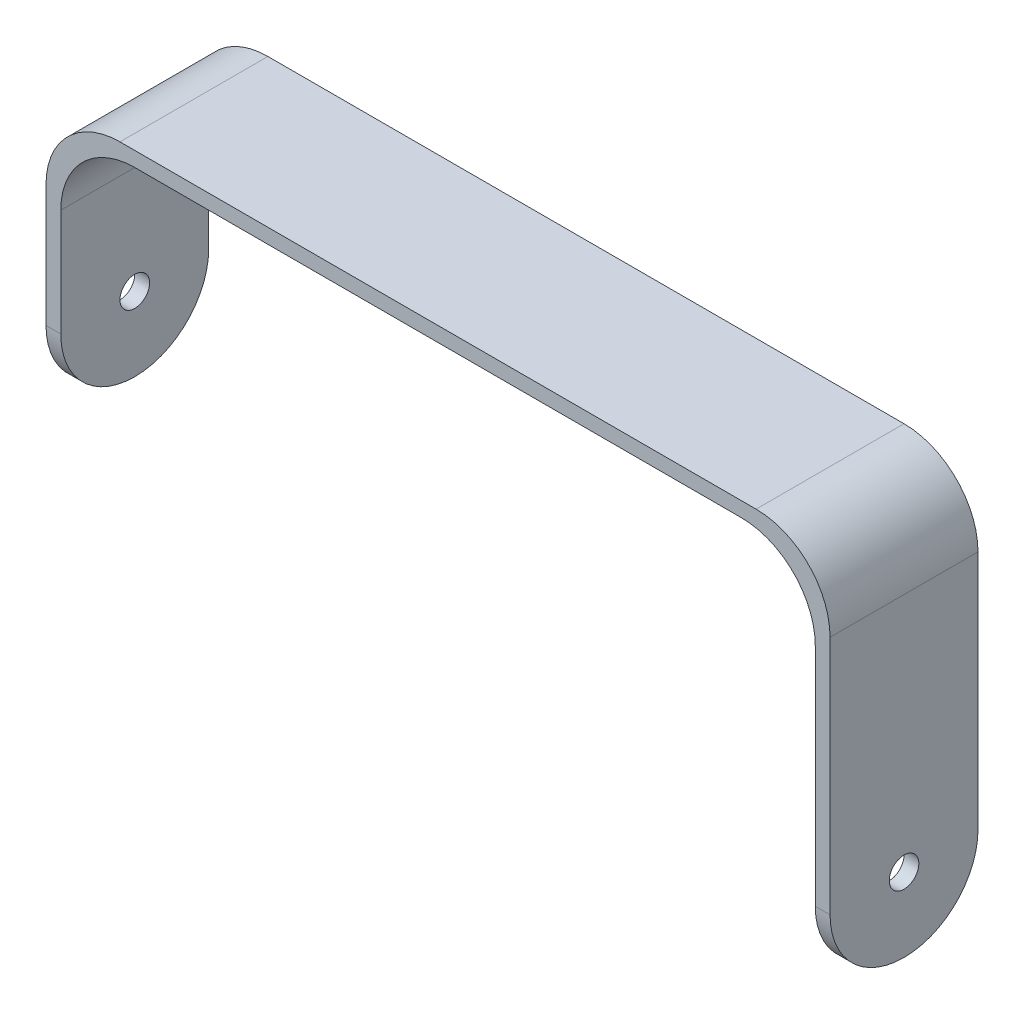
ISO-10303-21;
HEADER;
FILE_DESCRIPTION(('STEP AP214'),'2;1');
FILE_NAME('part.step','',(''),(''),'','','');
FILE_SCHEMA(('AUTOMOTIVE_DESIGN { 1 0 10303 214 1 1 1 1 }'));
ENDSEC;
DATA;
#1=APPLICATION_CONTEXT('core data for automotive mechanical design processes');
#2=APPLICATION_PROTOCOL_DEFINITION('international standard','automotive_design',2000,#1);
#3=PRODUCT_CONTEXT('',#1,'mechanical');
#4=PRODUCT('Part','Part','',(#3));
#5=PRODUCT_RELATED_PRODUCT_CATEGORY('part','',(#4));
#6=PRODUCT_DEFINITION_FORMATION('','',#4);
#7=PRODUCT_DEFINITION_CONTEXT('part definition',#1,'design');
#8=PRODUCT_DEFINITION('design','',#6,#7);
#9=PRODUCT_DEFINITION_SHAPE('','',#8);
#10=(LENGTH_UNIT() NAMED_UNIT(*) SI_UNIT(.MILLI.,.METRE.));
#11=(NAMED_UNIT(*) PLANE_ANGLE_UNIT() SI_UNIT($,.RADIAN.));
#12=(NAMED_UNIT(*) SI_UNIT($,.STERADIAN.) SOLID_ANGLE_UNIT());
#13=UNCERTAINTY_MEASURE_WITH_UNIT(LENGTH_MEASURE(1.E-05),#10,'distance_accuracy_value','');
#14=(GEOMETRIC_REPRESENTATION_CONTEXT(3) GLOBAL_UNCERTAINTY_ASSIGNED_CONTEXT((#13)) GLOBAL_UNIT_ASSIGNED_CONTEXT((#10,
#11,#12)) REPRESENTATION_CONTEXT('',''));
#15=CARTESIAN_POINT('',(0.,0.,0.));
#16=DIRECTION('',(0.,0.,1.));
#17=DIRECTION('',(1.,0.,0.));
#18=AXIS2_PLACEMENT_3D('',#15,#16,#17);
#19=CARTESIAN_POINT('',(-51.,0.,-10.));
#20=DIRECTION('',(0.,0.,-1.));
#21=DIRECTION('',(0.,-1.,0.));
#22=AXIS2_PLACEMENT_3D('',#19,#20,#21);
#23=PLANE('',#22);
#24=DIRECTION('',(0.,1.,0.));
#25=VECTOR('',#24,1.);
#26=CARTESIAN_POINT('',(53.,0.,-10.));
#27=LINE('',#26,#25);
#28=CARTESIAN_POINT('',(53.,-5.49999999999997,-10.));
#29=VERTEX_POINT('',#28);
#30=CARTESIAN_POINT('',(53.,27.,-10.));
#31=VERTEX_POINT('',#30);
#32=EDGE_CURVE('E145',#29,#31,#27,.T.);
#33=ORIENTED_EDGE('',*,*,#32,.F.);
#34=DIRECTION('',(1.,0.,0.));
#35=VECTOR('',#34,1.);
#36=CARTESIAN_POINT('',(28.411286003847,-5.49999999999997,-10.));
#37=LINE('',#36,#35);
#38=CARTESIAN_POINT('',(51.,-5.49999999999997,-10.));
#39=VERTEX_POINT('',#38);
#40=EDGE_CURVE('E135',#39,#29,#37,.T.);
#41=ORIENTED_EDGE('',*,*,#40,.F.);
#42=DIRECTION('',(0.,1.,0.));
#43=VECTOR('',#42,1.);
#44=CARTESIAN_POINT('',(51.,0.,-10.));
#45=LINE('',#44,#43);
#46=CARTESIAN_POINT('',(51.,25.,-10.));
#47=VERTEX_POINT('',#46);
#48=EDGE_CURVE('E143',#39,#47,#45,.T.);
#49=ORIENTED_EDGE('',*,*,#48,.T.);
#50=CARTESIAN_POINT('',(41.,25.,-10.));
#51=DIRECTION('',(0.,0.,-1.));
#52=DIRECTION('',(-1.,0.,0.));
#53=AXIS2_PLACEMENT_3D('',#50,#51,#52);
#54=CIRCLE('',#53,10.);
#55=CARTESIAN_POINT('',(41.,35.,-10.));
#56=VERTEX_POINT('',#55);
#57=EDGE_CURVE('E191',#47,#56,#54,.F.);
#58=ORIENTED_EDGE('',*,*,#57,.T.);
#59=DIRECTION('',(-1.,0.,0.));
#60=VECTOR('',#59,1.);
#61=CARTESIAN_POINT('',(-51.,35.,-10.));
#62=LINE('',#61,#60);
#63=CARTESIAN_POINT('',(-41.,35.,-10.));
#64=VERTEX_POINT('',#63);
#65=EDGE_CURVE('E151',#56,#64,#62,.T.);
#66=ORIENTED_EDGE('',*,*,#65,.T.);
#67=CARTESIAN_POINT('',(-41.,25.,-10.));
#68=DIRECTION('',(0.,0.,-1.));
#69=DIRECTION('',(-1.,0.,0.));
#70=AXIS2_PLACEMENT_3D('',#67,#68,#69);
#71=CIRCLE('',#70,10.);
#72=CARTESIAN_POINT('',(-51.,25.,-10.));
#73=VERTEX_POINT('',#72);
#74=EDGE_CURVE('E195',#64,#73,#71,.F.);
#75=ORIENTED_EDGE('',*,*,#74,.T.);
#76=DIRECTION('',(0.,-1.,0.));
#77=VECTOR('',#76,1.);
#78=CARTESIAN_POINT('',(-51.,0.,-10.));
#79=LINE('',#78,#77);
#80=CARTESIAN_POINT('',(-51.,10.5,-10.));
#81=VERTEX_POINT('',#80);
#82=EDGE_CURVE('E155',#73,#81,#79,.T.);
#83=ORIENTED_EDGE('',*,*,#82,.T.);
#84=DIRECTION('',(-1.,0.,0.));
#85=VECTOR('',#84,1.);
#86=CARTESIAN_POINT('',(-28.411286003847,10.5,-10.));
#87=LINE('',#86,#85);
#88=CARTESIAN_POINT('',(-53.,10.5,-10.));
#89=VERTEX_POINT('',#88);
#90=EDGE_CURVE('E251',#81,#89,#87,.T.);
#91=ORIENTED_EDGE('',*,*,#90,.T.);
#92=DIRECTION('',(0.,-1.,0.));
#93=VECTOR('',#92,1.);
#94=CARTESIAN_POINT('',(-53.,0.,-10.));
#95=LINE('',#94,#93);
#96=CARTESIAN_POINT('',(-53.,27.,-10.));
#97=VERTEX_POINT('',#96);
#98=EDGE_CURVE('E206',#97,#89,#95,.T.);
#99=ORIENTED_EDGE('',*,*,#98,.F.);
#100=CARTESIAN_POINT('',(-43.,27.,-10.));
#101=DIRECTION('',(0.,0.,-1.));
#102=DIRECTION('',(-1.,0.,0.));
#103=AXIS2_PLACEMENT_3D('',#100,#101,#102);
#104=CIRCLE('',#103,10.);
#105=CARTESIAN_POINT('',(-43.,37.,-10.));
#106=VERTEX_POINT('',#105);
#107=EDGE_CURVE('E53',#97,#106,#104,.T.);
#108=ORIENTED_EDGE('',*,*,#107,.T.);
#109=DIRECTION('',(-1.,0.,0.));
#110=VECTOR('',#109,1.);
#111=CARTESIAN_POINT('',(-51.,37.,-10.));
#112=LINE('',#111,#110);
#113=CARTESIAN_POINT('',(43.,37.,-10.));
#114=VERTEX_POINT('',#113);
#115=EDGE_CURVE('E203',#114,#106,#112,.T.);
#116=ORIENTED_EDGE('',*,*,#115,.F.);
#117=CARTESIAN_POINT('',(43.,27.,-10.));
#118=DIRECTION('',(0.,0.,-1.));
#119=DIRECTION('',(-1.,0.,0.));
#120=AXIS2_PLACEMENT_3D('',#117,#118,#119);
#121=CIRCLE('',#120,10.);
#122=EDGE_CURVE('E11',#114,#31,#121,.T.);
#123=ORIENTED_EDGE('',*,*,#122,.T.);
#124=EDGE_LOOP('',(#33,#41,#49,#58,#66,#75,#83,#91,#99,#108,#116,#123));
#125=FACE_BOUND('',#124,.T.);
#126=ADVANCED_FACE('F45',(#125),#23,.T.);
#127=CARTESIAN_POINT('',(-51.,35.,10.));
#128=DIRECTION('',(0.,0.,-1.));
#129=DIRECTION('',(-1.,0.,0.));
#130=AXIS2_PLACEMENT_3D('',#127,#128,#129);
#131=PLANE('',#130);
#132=DIRECTION('',(0.,1.,0.));
#133=VECTOR('',#132,1.);
#134=CARTESIAN_POINT('',(51.,0.,10.));
#135=LINE('',#134,#133);
#136=CARTESIAN_POINT('',(51.,-5.49999999999997,10.));
#137=VERTEX_POINT('',#136);
#138=CARTESIAN_POINT('',(51.,25.,10.));
#139=VERTEX_POINT('',#138);
#140=EDGE_CURVE('E166',#137,#139,#135,.T.);
#141=ORIENTED_EDGE('',*,*,#140,.F.);
#142=DIRECTION('',(1.,0.,0.));
#143=VECTOR('',#142,1.);
#144=CARTESIAN_POINT('',(28.411286003847,-5.49999999999997,10.));
#145=LINE('',#144,#143);
#146=CARTESIAN_POINT('',(53.,-5.49999999999997,10.));
#147=VERTEX_POINT('',#146);
#148=EDGE_CURVE('E60',#137,#147,#145,.T.);
#149=ORIENTED_EDGE('',*,*,#148,.T.);
#150=DIRECTION('',(0.,1.,0.));
#151=VECTOR('',#150,1.);
#152=CARTESIAN_POINT('',(53.,0.,10.));
#153=LINE('',#152,#151);
#154=CARTESIAN_POINT('',(53.,27.,10.));
#155=VERTEX_POINT('',#154);
#156=EDGE_CURVE('E226',#147,#155,#153,.T.);
#157=ORIENTED_EDGE('',*,*,#156,.T.);
#158=CARTESIAN_POINT('',(43.,27.,10.));
#159=DIRECTION('',(0.,0.,-1.));
#160=DIRECTION('',(-1.,0.,0.));
#161=AXIS2_PLACEMENT_3D('',#158,#159,#160);
#162=CIRCLE('',#161,10.);
#163=CARTESIAN_POINT('',(43.,37.,10.));
#164=VERTEX_POINT('',#163);
#165=EDGE_CURVE('E199',#155,#164,#162,.F.);
#166=ORIENTED_EDGE('',*,*,#165,.T.);
#167=DIRECTION('',(-1.,0.,0.));
#168=VECTOR('',#167,1.);
#169=CARTESIAN_POINT('',(-51.,37.,10.));
#170=LINE('',#169,#168);
#171=CARTESIAN_POINT('',(-43.,37.,10.));
#172=VERTEX_POINT('',#171);
#173=EDGE_CURVE('E219',#164,#172,#170,.T.);
#174=ORIENTED_EDGE('',*,*,#173,.T.);
#175=CARTESIAN_POINT('',(-43.,27.,10.));
#176=DIRECTION('',(0.,0.,-1.));
#177=DIRECTION('',(-1.,0.,0.));
#178=AXIS2_PLACEMENT_3D('',#175,#176,#177);
#179=CIRCLE('',#178,10.);
#180=CARTESIAN_POINT('',(-53.,27.,10.));
#181=VERTEX_POINT('',#180);
#182=EDGE_CURVE('E197',#172,#181,#179,.F.);
#183=ORIENTED_EDGE('',*,*,#182,.T.);
#184=DIRECTION('',(0.,-1.,0.));
#185=VECTOR('',#184,1.);
#186=CARTESIAN_POINT('',(-53.,0.,10.));
#187=LINE('',#186,#185);
#188=CARTESIAN_POINT('',(-53.,10.5,10.));
#189=VERTEX_POINT('',#188);
#190=EDGE_CURVE('E172',#181,#189,#187,.T.);
#191=ORIENTED_EDGE('',*,*,#190,.T.);
#192=DIRECTION('',(-1.,0.,0.));
#193=VECTOR('',#192,1.);
#194=CARTESIAN_POINT('',(-28.411286003847,10.5,10.));
#195=LINE('',#194,#193);
#196=CARTESIAN_POINT('',(-51.,10.5,10.));
#197=VERTEX_POINT('',#196);
#198=EDGE_CURVE('E253',#197,#189,#195,.T.);
#199=ORIENTED_EDGE('',*,*,#198,.F.);
#200=DIRECTION('',(0.,-1.,0.));
#201=VECTOR('',#200,1.);
#202=CARTESIAN_POINT('',(-51.,0.,10.));
#203=LINE('',#202,#201);
#204=CARTESIAN_POINT('',(-51.,25.,10.));
#205=VERTEX_POINT('',#204);
#206=EDGE_CURVE('E165',#205,#197,#203,.T.);
#207=ORIENTED_EDGE('',*,*,#206,.F.);
#208=CARTESIAN_POINT('',(-41.,25.,10.));
#209=DIRECTION('',(0.,0.,-1.));
#210=DIRECTION('',(-1.,0.,0.));
#211=AXIS2_PLACEMENT_3D('',#208,#209,#210);
#212=CIRCLE('',#211,10.);
#213=CARTESIAN_POINT('',(-41.,35.,10.));
#214=VERTEX_POINT('',#213);
#215=EDGE_CURVE('E193',#205,#214,#212,.T.);
#216=ORIENTED_EDGE('',*,*,#215,.T.);
#217=DIRECTION('',(-1.,0.,0.));
#218=VECTOR('',#217,1.);
#219=CARTESIAN_POINT('',(-51.,35.,10.));
#220=LINE('',#219,#218);
#221=CARTESIAN_POINT('',(41.,35.,10.));
#222=VERTEX_POINT('',#221);
#223=EDGE_CURVE('E162',#222,#214,#220,.T.);
#224=ORIENTED_EDGE('',*,*,#223,.F.);
#225=CARTESIAN_POINT('',(41.,25.,10.));
#226=DIRECTION('',(0.,0.,-1.));
#227=DIRECTION('',(-1.,0.,0.));
#228=AXIS2_PLACEMENT_3D('',#225,#226,#227);
#229=CIRCLE('',#228,10.);
#230=EDGE_CURVE('E188',#222,#139,#229,.T.);
#231=ORIENTED_EDGE('',*,*,#230,.T.);
#232=EDGE_LOOP('',(#141,#149,#157,#166,#174,#183,#191,#199,#207,#216,#224,#231));
#233=FACE_BOUND('',#232,.T.);
#234=ADVANCED_FACE('F216',(#233),#131,.F.);
#235=CARTESIAN_POINT('',(-53.,0.,0.));
#236=DIRECTION('',(-1.,0.,0.));
#237=DIRECTION('',(0.,-1.,0.));
#238=AXIS2_PLACEMENT_3D('',#235,#236,#237);
#239=PLANE('',#238);
#240=ORIENTED_EDGE('',*,*,#190,.F.);
#241=DIRECTION('',(0.,0.,1.));
#242=VECTOR('',#241,1.);
#243=CARTESIAN_POINT('',(-53.,27.,0.));
#244=LINE('',#243,#242);
#245=EDGE_CURVE('E68',#181,#97,#244,.F.);
#246=ORIENTED_EDGE('',*,*,#245,.T.);
#247=ORIENTED_EDGE('',*,*,#98,.T.);
#248=CARTESIAN_POINT('',(-53.,10.5,0.));
#249=DIRECTION('',(1.,0.,0.));
#250=DIRECTION('',(0.,0.,1.));
#251=AXIS2_PLACEMENT_3D('',#248,#249,#250);
#252=CIRCLE('',#251,10.);
#253=EDGE_CURVE('E224',#189,#89,#252,.T.);
#254=ORIENTED_EDGE('',*,*,#253,.F.);
#255=EDGE_LOOP('',(#240,#246,#247,#254));
#256=FACE_BOUND('',#255,.T.);
#257=CARTESIAN_POINT('',(-53.,10.5,0.));
#258=DIRECTION('',(-1.,0.,0.));
#259=DIRECTION('',(0.,0.,1.));
#260=AXIS2_PLACEMENT_3D('',#257,#258,#259);
#261=CIRCLE('',#260,2.);
#262=CARTESIAN_POINT('',(-53.,10.5,2.));
#263=VERTEX_POINT('',#262);
#264=EDGE_CURVE('E158',#263,#263,#261,.T.);
#265=ORIENTED_EDGE('',*,*,#264,.F.);
#266=EDGE_LOOP('',(#265));
#267=FACE_BOUND('',#266,.T.);
#268=ADVANCED_FACE('F221',(#256,#267),#239,.T.);
#269=CARTESIAN_POINT('',(-51.,37.,0.));
#270=DIRECTION('',(0.,1.,0.));
#271=DIRECTION('',(-1.,0.,0.));
#272=AXIS2_PLACEMENT_3D('',#269,#270,#271);
#273=PLANE('',#272);
#274=ORIENTED_EDGE('',*,*,#173,.F.);
#275=DIRECTION('',(0.,0.,1.));
#276=VECTOR('',#275,1.);
#277=CARTESIAN_POINT('',(43.,37.,0.));
#278=LINE('',#277,#276);
#279=EDGE_CURVE('E182',#164,#114,#278,.F.);
#280=ORIENTED_EDGE('',*,*,#279,.T.);
#281=ORIENTED_EDGE('',*,*,#115,.T.);
#282=DIRECTION('',(0.,0.,1.));
#283=VECTOR('',#282,1.);
#284=CARTESIAN_POINT('',(-43.,37.,0.));
#285=LINE('',#284,#283);
#286=EDGE_CURVE('E179',#106,#172,#285,.T.);
#287=ORIENTED_EDGE('',*,*,#286,.T.);
#288=EDGE_LOOP('',(#274,#280,#281,#287));
#289=FACE_BOUND('',#288,.T.);
#290=ADVANCED_FACE('F211',(#289),#273,.T.);
#291=CARTESIAN_POINT('',(53.,0.,0.));
#292=DIRECTION('',(1.,0.,0.));
#293=DIRECTION('',(0.,1.,0.));
#294=AXIS2_PLACEMENT_3D('',#291,#292,#293);
#295=PLANE('',#294);
#296=CARTESIAN_POINT('',(53.,-5.49999999999997,0.));
#297=DIRECTION('',(-1.,0.,0.));
#298=DIRECTION('',(0.,0.,-1.));
#299=AXIS2_PLACEMENT_3D('',#296,#297,#298);
#300=CIRCLE('',#299,10.);
#301=EDGE_CURVE('E240',#29,#147,#300,.T.);
#302=ORIENTED_EDGE('',*,*,#301,.F.);
#303=ORIENTED_EDGE('',*,*,#32,.T.);
#304=DIRECTION('',(0.,0.,1.));
#305=VECTOR('',#304,1.);
#306=CARTESIAN_POINT('',(53.,27.,0.));
#307=LINE('',#306,#305);
#308=EDGE_CURVE('E176',#31,#155,#307,.T.);
#309=ORIENTED_EDGE('',*,*,#308,.T.);
#310=ORIENTED_EDGE('',*,*,#156,.F.);
#311=EDGE_LOOP('',(#302,#303,#309,#310));
#312=FACE_BOUND('',#311,.T.);
#313=CARTESIAN_POINT('',(53.,-5.49999999999997,0.));
#314=DIRECTION('',(1.,0.,0.));
#315=DIRECTION('',(0.,0.,-1.));
#316=AXIS2_PLACEMENT_3D('',#313,#314,#315);
#317=CIRCLE('',#316,2.);
#318=CARTESIAN_POINT('',(53.,-5.49999999999997,-2.));
#319=VERTEX_POINT('',#318);
#320=EDGE_CURVE('E241',#319,#319,#317,.T.);
#321=ORIENTED_EDGE('',*,*,#320,.F.);
#322=EDGE_LOOP('',(#321));
#323=FACE_BOUND('',#322,.T.);
#324=ADVANCED_FACE('F238',(#312,#323),#295,.T.);
#325=CARTESIAN_POINT('',(-51.,0.,0.));
#326=DIRECTION('',(-1.,0.,0.));
#327=DIRECTION('',(0.,-1.,0.));
#328=AXIS2_PLACEMENT_3D('',#325,#326,#327);
#329=PLANE('',#328);
#330=CARTESIAN_POINT('',(-51.,10.5,0.));
#331=DIRECTION('',(-1.,0.,0.));
#332=DIRECTION('',(0.,-1.,0.));
#333=AXIS2_PLACEMENT_3D('',#330,#331,#332);
#334=CIRCLE('',#333,2.);
#335=CARTESIAN_POINT('',(-51.,10.5,2.));
#336=VERTEX_POINT('',#335);
#337=EDGE_CURVE('E152',#336,#336,#334,.F.);
#338=ORIENTED_EDGE('',*,*,#337,.F.);
#339=EDGE_LOOP('',(#338));
#340=FACE_BOUND('',#339,.T.);
#341=ORIENTED_EDGE('',*,*,#82,.F.);
#342=DIRECTION('',(0.,0.,1.));
#343=VECTOR('',#342,1.);
#344=CARTESIAN_POINT('',(-51.,25.,10.));
#345=LINE('',#344,#343);
#346=EDGE_CURVE('E184',#73,#205,#345,.T.);
#347=ORIENTED_EDGE('',*,*,#346,.T.);
#348=ORIENTED_EDGE('',*,*,#206,.T.);
#349=CARTESIAN_POINT('',(-51.,10.5,0.));
#350=DIRECTION('',(-1.,0.,0.));
#351=DIRECTION('',(0.,-1.,0.));
#352=AXIS2_PLACEMENT_3D('',#349,#350,#351);
#353=CIRCLE('',#352,10.);
#354=EDGE_CURVE('E250',#81,#197,#353,.T.);
#355=ORIENTED_EDGE('',*,*,#354,.F.);
#356=EDGE_LOOP('',(#341,#347,#348,#355));
#357=FACE_BOUND('',#356,.T.);
#358=ADVANCED_FACE('F277',(#340,#357),#329,.F.);
#359=CARTESIAN_POINT('',(-51.,35.,0.));
#360=DIRECTION('',(0.,1.,0.));
#361=DIRECTION('',(-1.,0.,0.));
#362=AXIS2_PLACEMENT_3D('',#359,#360,#361);
#363=PLANE('',#362);
#364=ORIENTED_EDGE('',*,*,#65,.F.);
#365=DIRECTION('',(0.,0.,1.));
#366=VECTOR('',#365,1.);
#367=CARTESIAN_POINT('',(41.,35.,10.));
#368=LINE('',#367,#366);
#369=EDGE_CURVE('E171',#56,#222,#368,.T.);
#370=ORIENTED_EDGE('',*,*,#369,.T.);
#371=ORIENTED_EDGE('',*,*,#223,.T.);
#372=DIRECTION('',(0.,0.,1.));
#373=VECTOR('',#372,1.);
#374=CARTESIAN_POINT('',(-41.,35.,-10.));
#375=LINE('',#374,#373);
#376=EDGE_CURVE('E169',#214,#64,#375,.F.);
#377=ORIENTED_EDGE('',*,*,#376,.T.);
#378=EDGE_LOOP('',(#364,#370,#371,#377));
#379=FACE_BOUND('',#378,.T.);
#380=ADVANCED_FACE('F304',(#379),#363,.F.);
#381=CARTESIAN_POINT('',(51.,0.,0.));
#382=DIRECTION('',(1.,0.,0.));
#383=DIRECTION('',(0.,1.,0.));
#384=AXIS2_PLACEMENT_3D('',#381,#382,#383);
#385=PLANE('',#384);
#386=CARTESIAN_POINT('',(51.,-5.49999999999997,0.));
#387=DIRECTION('',(1.,0.,0.));
#388=DIRECTION('',(0.,1.,0.));
#389=AXIS2_PLACEMENT_3D('',#386,#387,#388);
#390=CIRCLE('',#389,2.);
#391=CARTESIAN_POINT('',(51.,-3.49999999999997,0.));
#392=VERTEX_POINT('',#391);
#393=EDGE_CURVE('E244',#392,#392,#390,.F.);
#394=ORIENTED_EDGE('',*,*,#393,.F.);
#395=EDGE_LOOP('',(#394));
#396=FACE_BOUND('',#395,.T.);
#397=ORIENTED_EDGE('',*,*,#48,.F.);
#398=CARTESIAN_POINT('',(51.,-5.49999999999997,0.));
#399=DIRECTION('',(1.,0.,0.));
#400=DIRECTION('',(0.,1.,0.));
#401=AXIS2_PLACEMENT_3D('',#398,#399,#400);
#402=CIRCLE('',#401,10.);
#403=EDGE_CURVE('E132',#137,#39,#402,.T.);
#404=ORIENTED_EDGE('',*,*,#403,.F.);
#405=ORIENTED_EDGE('',*,*,#140,.T.);
#406=DIRECTION('',(0.,0.,1.));
#407=VECTOR('',#406,1.);
#408=CARTESIAN_POINT('',(51.,25.,-10.));
#409=LINE('',#408,#407);
#410=EDGE_CURVE('E149',#139,#47,#409,.F.);
#411=ORIENTED_EDGE('',*,*,#410,.T.);
#412=EDGE_LOOP('',(#397,#404,#405,#411));
#413=FACE_BOUND('',#412,.T.);
#414=ADVANCED_FACE('F147',(#396,#413),#385,.F.);
#415=CARTESIAN_POINT('',(-28.411286003847,10.5,0.));
#416=DIRECTION('',(-1.,0.,0.));
#417=DIRECTION('',(0.,0.,1.));
#418=AXIS2_PLACEMENT_3D('',#415,#416,#417);
#419=CYLINDRICAL_SURFACE('',#418,2.);
#420=CARTESIAN_POINT('',(-51.,10.5,2.));
#421=CARTESIAN_POINT('',(-51.0208333333333,10.5,2.));
#422=CARTESIAN_POINT('',(-51.0416666666667,10.5,2.));
#423=CARTESIAN_POINT('',(-51.0833333333333,10.5,2.));
#424=CARTESIAN_POINT('',(-51.1041666666667,10.5,2.));
#425=CARTESIAN_POINT('',(-51.1458333333333,10.5,2.));
#426=CARTESIAN_POINT('',(-51.1666666666667,10.5,2.));
#427=CARTESIAN_POINT('',(-51.2083333333333,10.5,2.));
#428=CARTESIAN_POINT('',(-51.2291666666667,10.5,2.));
#429=CARTESIAN_POINT('',(-51.2708333333333,10.5,2.));
#430=CARTESIAN_POINT('',(-51.2916666666667,10.5,2.));
#431=CARTESIAN_POINT('',(-51.3333333333333,10.5,2.));
#432=CARTESIAN_POINT('',(-51.3541666666667,10.5,2.));
#433=CARTESIAN_POINT('',(-51.3958333333333,10.5,2.));
#434=CARTESIAN_POINT('',(-51.4166666666667,10.5,2.));
#435=CARTESIAN_POINT('',(-51.4583333333333,10.5,2.));
#436=CARTESIAN_POINT('',(-51.4791666666667,10.5,2.));
#437=CARTESIAN_POINT('',(-51.5208333333333,10.5,2.));
#438=CARTESIAN_POINT('',(-51.5416666666667,10.5,2.));
#439=CARTESIAN_POINT('',(-51.5833333333333,10.5,2.));
#440=CARTESIAN_POINT('',(-51.6041666666667,10.5,2.));
#441=CARTESIAN_POINT('',(-51.6458333333333,10.5,2.));
#442=CARTESIAN_POINT('',(-51.6666666666667,10.5,2.));
#443=CARTESIAN_POINT('',(-51.7083333333333,10.5,2.));
#444=CARTESIAN_POINT('',(-51.7291666666667,10.5,2.));
#445=CARTESIAN_POINT('',(-51.7708333333333,10.5,2.));
#446=CARTESIAN_POINT('',(-51.7916666666667,10.5,2.));
#447=CARTESIAN_POINT('',(-51.8333333333333,10.5,2.));
#448=CARTESIAN_POINT('',(-51.8541666666667,10.5,2.));
#449=CARTESIAN_POINT('',(-51.8958333333333,10.5,2.));
#450=CARTESIAN_POINT('',(-51.9166666666667,10.5,2.));
#451=CARTESIAN_POINT('',(-51.9583333333333,10.5,2.));
#452=CARTESIAN_POINT('',(-51.9791666666667,10.5,2.));
#453=CARTESIAN_POINT('',(-52.0208333333333,10.5,2.));
#454=CARTESIAN_POINT('',(-52.0416666666667,10.5,2.));
#455=CARTESIAN_POINT('',(-52.0833333333333,10.5,2.));
#456=CARTESIAN_POINT('',(-52.1041666666667,10.5,2.));
#457=CARTESIAN_POINT('',(-52.1458333333333,10.5,2.));
#458=CARTESIAN_POINT('',(-52.1666666666667,10.5,2.));
#459=CARTESIAN_POINT('',(-52.2083333333333,10.5,2.));
#460=CARTESIAN_POINT('',(-52.2291666666667,10.5,2.));
#461=CARTESIAN_POINT('',(-52.2708333333333,10.5,2.));
#462=CARTESIAN_POINT('',(-52.2916666666667,10.5,2.));
#463=CARTESIAN_POINT('',(-52.3333333333333,10.5,2.));
#464=CARTESIAN_POINT('',(-52.3541666666667,10.5,2.));
#465=CARTESIAN_POINT('',(-52.3958333333333,10.5,2.));
#466=CARTESIAN_POINT('',(-52.4166666666667,10.5,2.));
#467=CARTESIAN_POINT('',(-52.4583333333333,10.5,2.));
#468=CARTESIAN_POINT('',(-52.4791666666667,10.5,2.));
#469=CARTESIAN_POINT('',(-52.5208333333333,10.5,2.));
#470=CARTESIAN_POINT('',(-52.5416666666667,10.5,2.));
#471=CARTESIAN_POINT('',(-52.5833333333333,10.5,2.));
#472=CARTESIAN_POINT('',(-52.6041666666667,10.5,2.));
#473=CARTESIAN_POINT('',(-52.6458333333333,10.5,2.));
#474=CARTESIAN_POINT('',(-52.6666666666667,10.5,2.));
#475=CARTESIAN_POINT('',(-52.7083333333333,10.5,2.));
#476=CARTESIAN_POINT('',(-52.7291666666667,10.5,2.));
#477=CARTESIAN_POINT('',(-52.7708333333333,10.5,2.));
#478=CARTESIAN_POINT('',(-52.7916666666667,10.5,2.));
#479=CARTESIAN_POINT('',(-52.8333333333333,10.5,2.));
#480=CARTESIAN_POINT('',(-52.8541666666667,10.5,2.));
#481=CARTESIAN_POINT('',(-52.8958333333333,10.5,2.));
#482=CARTESIAN_POINT('',(-52.9166666666667,10.5,2.));
#483=CARTESIAN_POINT('',(-52.9583333333333,10.5,2.));
#484=CARTESIAN_POINT('',(-52.9791666666667,10.5,2.));
#485=CARTESIAN_POINT('',(-53.,10.5,2.));
#486=B_SPLINE_CURVE_WITH_KNOTS('',3,(#420,#421,#422,#423,#424,#425,#426,#427,#428,#429,#430,
#431,#432,#433,#434,#435,#436,#437,#438,#439,#440,#441,#442,#443,#444,#445,#446,#447,#448,#449,
#450,#451,#452,#453,#454,#455,#456,#457,#458,#459,#460,#461,#462,#463,#464,#465,#466,#467,#468,
#469,#470,#471,#472,#473,#474,#475,#476,#477,#478,#479,#480,#481,#482,#483,#484,#485),
.UNSPECIFIED.,.F.,.F.,(4,2,2,2,2,2,2,2,2,2,2,2,2,2,2,2,2,2,2,2,2,2,2,2,2,2,2,2,2,2,2,2,4),(0.,
0.0625000000000001,0.125,0.1875,0.25,0.3125,0.375000000000007,0.4375,0.500000000000007,0.5625,
0.625000000000008,0.687500000000001,0.750000000000008,0.812500000000008,0.875000000000008,
0.937500000000008,1.00000000000001,1.06250000000001,1.12500000000001,1.18750000000001,
1.25000000000001,1.31250000000002,1.37500000000001,1.43750000000002,1.50000000000001,
1.56250000000002,1.62500000000001,1.68750000000002,1.75000000000002,1.81250000000002,
1.87500000000002,1.93750000000002,2.00000000000002),.UNSPECIFIED.);
#487=EDGE_CURVE('BSEAM260',#336,#263,#486,.T.);
#488=ORIENTED_EDGE('',*,*,#337,.T.);
#489=ORIENTED_EDGE('',*,*,#264,.T.);
#490=ORIENTED_EDGE('',*,*,#487,.T.);
#491=ORIENTED_EDGE('',*,*,#487,.F.);
#492=EDGE_LOOP('',(#488,#490,#489,#491));
#493=FACE_BOUND('',#492,.T.);
#494=ADVANCED_FACE('F260',(#493),#419,.F.);
#495=CARTESIAN_POINT('',(-28.411286003847,10.5,0.));
#496=DIRECTION('',(-1.,0.,0.));
#497=DIRECTION('',(0.,0.,1.));
#498=AXIS2_PLACEMENT_3D('',#495,#496,#497);
#499=CYLINDRICAL_SURFACE('',#498,10.);
#500=ORIENTED_EDGE('',*,*,#354,.T.);
#501=ORIENTED_EDGE('',*,*,#198,.T.);
#502=ORIENTED_EDGE('',*,*,#253,.T.);
#503=ORIENTED_EDGE('',*,*,#90,.F.);
#504=EDGE_LOOP('',(#500,#501,#502,#503));
#505=FACE_BOUND('',#504,.T.);
#506=ADVANCED_FACE('F283',(#505),#499,.T.);
#507=CARTESIAN_POINT('',(41.,25.,0.));
#508=DIRECTION('',(0.,0.,-1.));
#509=DIRECTION('',(-1.,0.,0.));
#510=AXIS2_PLACEMENT_3D('',#507,#508,#509);
#511=CYLINDRICAL_SURFACE('',#510,10.);
#512=ORIENTED_EDGE('',*,*,#57,.F.);
#513=ORIENTED_EDGE('',*,*,#410,.F.);
#514=ORIENTED_EDGE('',*,*,#230,.F.);
#515=ORIENTED_EDGE('',*,*,#369,.F.);
#516=EDGE_LOOP('',(#512,#513,#514,#515));
#517=FACE_BOUND('',#516,.T.);
#518=ADVANCED_FACE('F280',(#517),#511,.F.);
#519=CARTESIAN_POINT('',(43.,27.,0.));
#520=DIRECTION('',(0.,0.,1.));
#521=DIRECTION('',(1.,0.,0.));
#522=AXIS2_PLACEMENT_3D('',#519,#520,#521);
#523=CYLINDRICAL_SURFACE('',#522,10.);
#524=ORIENTED_EDGE('',*,*,#122,.F.);
#525=ORIENTED_EDGE('',*,*,#279,.F.);
#526=ORIENTED_EDGE('',*,*,#165,.F.);
#527=ORIENTED_EDGE('',*,*,#308,.F.);
#528=EDGE_LOOP('',(#524,#525,#526,#527));
#529=FACE_BOUND('',#528,.T.);
#530=ADVANCED_FACE('F237',(#529),#523,.T.);
#531=CARTESIAN_POINT('',(-41.,25.,0.));
#532=DIRECTION('',(0.,0.,-1.));
#533=DIRECTION('',(-1.,0.,0.));
#534=AXIS2_PLACEMENT_3D('',#531,#532,#533);
#535=CYLINDRICAL_SURFACE('',#534,10.);
#536=ORIENTED_EDGE('',*,*,#74,.F.);
#537=ORIENTED_EDGE('',*,*,#376,.F.);
#538=ORIENTED_EDGE('',*,*,#215,.F.);
#539=ORIENTED_EDGE('',*,*,#346,.F.);
#540=EDGE_LOOP('',(#536,#537,#538,#539));
#541=FACE_BOUND('',#540,.T.);
#542=ADVANCED_FACE('F286',(#541),#535,.F.);
#543=CARTESIAN_POINT('',(-43.,27.,0.));
#544=DIRECTION('',(0.,0.,1.));
#545=DIRECTION('',(1.,0.,0.));
#546=AXIS2_PLACEMENT_3D('',#543,#544,#545);
#547=CYLINDRICAL_SURFACE('',#546,10.);
#548=ORIENTED_EDGE('',*,*,#107,.F.);
#549=ORIENTED_EDGE('',*,*,#245,.F.);
#550=ORIENTED_EDGE('',*,*,#182,.F.);
#551=ORIENTED_EDGE('',*,*,#286,.F.);
#552=EDGE_LOOP('',(#548,#549,#550,#551));
#553=FACE_BOUND('',#552,.T.);
#554=ADVANCED_FACE('F47',(#553),#547,.T.);
#555=CARTESIAN_POINT('',(28.411286003847,-5.49999999999997,0.));
#556=DIRECTION('',(1.,0.,0.));
#557=DIRECTION('',(0.,0.,-1.));
#558=AXIS2_PLACEMENT_3D('',#555,#556,#557);
#559=CYLINDRICAL_SURFACE('',#558,2.);
#560=ORIENTED_EDGE('',*,*,#393,.T.);
#561=EDGE_LOOP('',(#560));
#562=FACE_BOUND('',#561,.T.);
#563=ORIENTED_EDGE('',*,*,#320,.T.);
#564=EDGE_LOOP('',(#563));
#565=FACE_BOUND('',#564,.T.);
#566=ADVANCED_FACE('F291',(#562,#565),#559,.F.);
#567=CARTESIAN_POINT('',(28.411286003847,-5.49999999999997,0.));
#568=DIRECTION('',(1.,0.,0.));
#569=DIRECTION('',(0.,0.,-1.));
#570=AXIS2_PLACEMENT_3D('',#567,#568,#569);
#571=CYLINDRICAL_SURFACE('',#570,10.);
#572=ORIENTED_EDGE('',*,*,#403,.T.);
#573=ORIENTED_EDGE('',*,*,#40,.T.);
#574=ORIENTED_EDGE('',*,*,#301,.T.);
#575=ORIENTED_EDGE('',*,*,#148,.F.);
#576=EDGE_LOOP('',(#572,#573,#574,#575));
#577=FACE_BOUND('',#576,.T.);
#578=ADVANCED_FACE('F134',(#577),#571,.T.);
#579=CLOSED_SHELL('',(#126,#234,#268,#290,#324,#358,#380,#414,#494,#506,#518,#530,#542,#554,
#566,#578));
#580=MANIFOLD_SOLID_BREP('B2',#579);
#581=ADVANCED_BREP_SHAPE_REPRESENTATION('',(#18,#580),#14);
#582=SHAPE_DEFINITION_REPRESENTATION(#9,#581);
ENDSEC;
END-ISO-10303-21;
